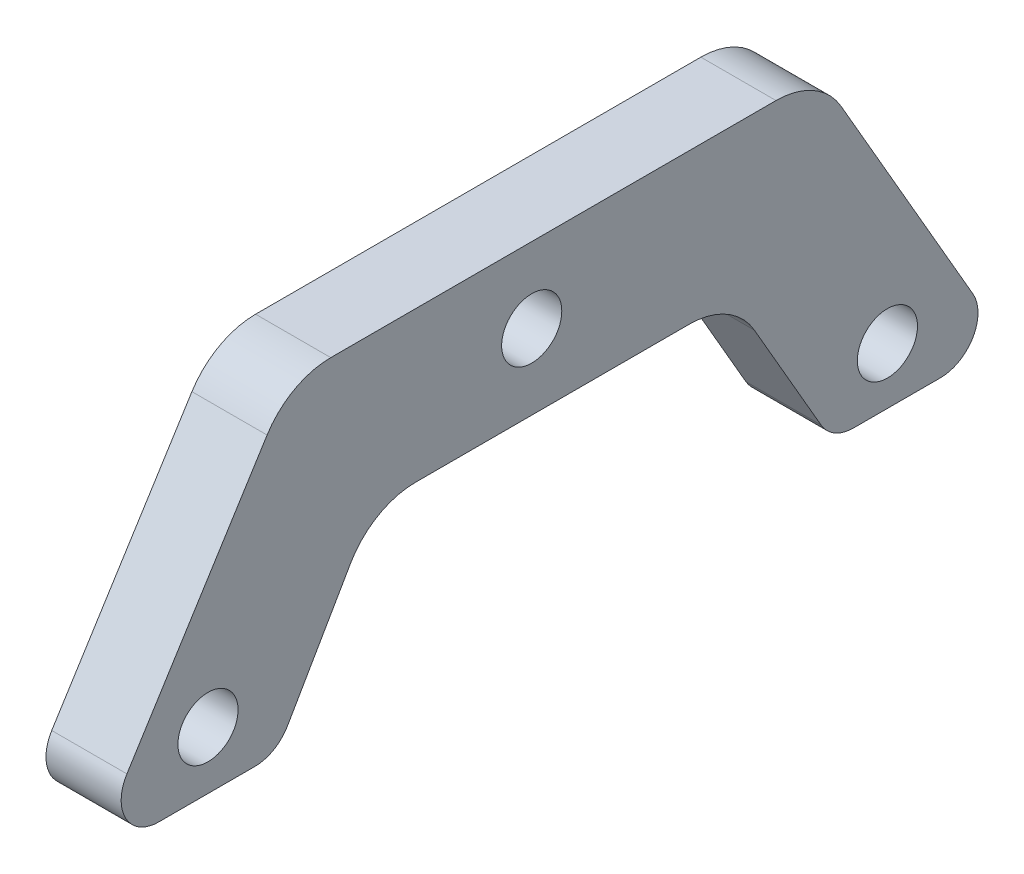
ISO-10303-21;
HEADER;
FILE_DESCRIPTION(('STEP AP214'),'2;1');
FILE_NAME('part.step','',(''),(''),'','','');
FILE_SCHEMA(('AUTOMOTIVE_DESIGN { 1 0 10303 214 1 1 1 1 }'));
ENDSEC;
DATA;
#1=APPLICATION_CONTEXT('core data for automotive mechanical design processes');
#2=APPLICATION_PROTOCOL_DEFINITION('international standard','automotive_design',2000,#1);
#3=PRODUCT_CONTEXT('',#1,'mechanical');
#4=PRODUCT('Part','Part','',(#3));
#5=PRODUCT_RELATED_PRODUCT_CATEGORY('part','',(#4));
#6=PRODUCT_DEFINITION_FORMATION('','',#4);
#7=PRODUCT_DEFINITION_CONTEXT('part definition',#1,'design');
#8=PRODUCT_DEFINITION('design','',#6,#7);
#9=PRODUCT_DEFINITION_SHAPE('','',#8);
#10=(LENGTH_UNIT() NAMED_UNIT(*) SI_UNIT(.MILLI.,.METRE.));
#11=(NAMED_UNIT(*) PLANE_ANGLE_UNIT() SI_UNIT($,.RADIAN.));
#12=(NAMED_UNIT(*) SI_UNIT($,.STERADIAN.) SOLID_ANGLE_UNIT());
#13=UNCERTAINTY_MEASURE_WITH_UNIT(LENGTH_MEASURE(1.E-05),#10,'distance_accuracy_value','');
#14=(GEOMETRIC_REPRESENTATION_CONTEXT(3) GLOBAL_UNCERTAINTY_ASSIGNED_CONTEXT((#13)) GLOBAL_UNIT_ASSIGNED_CONTEXT((#10,
#11,#12)) REPRESENTATION_CONTEXT('',''));
#15=CARTESIAN_POINT('',(0.,0.,0.));
#16=DIRECTION('',(0.,0.,1.));
#17=DIRECTION('',(1.,0.,0.));
#18=AXIS2_PLACEMENT_3D('',#15,#16,#17);
#19=CARTESIAN_POINT('',(20.,79.4132003226979,-33.441717861569));
#20=DIRECTION('',(-1.,0.,0.));
#21=DIRECTION('',(0.,0.,1.));
#22=AXIS2_PLACEMENT_3D('',#19,#20,#21);
#23=PLANE('',#22);
#24=CARTESIAN_POINT('',(20.,79.4132003226979,-33.441717861569));
#25=DIRECTION('',(1.,0.,0.));
#26=DIRECTION('',(0.,0.,1.));
#27=AXIS2_PLACEMENT_3D('',#24,#25,#26);
#28=CIRCLE('',#27,20.);
#29=CARTESIAN_POINT('',(20.,89.4132003226979,-50.7622259372578));
#30=VERTEX_POINT('',#29);
#31=CARTESIAN_POINT('',(20.,99.413200322698,-33.441717861569));
#32=VERTEX_POINT('',#31);
#33=EDGE_CURVE('E213',#30,#32,#28,.T.);
#34=ORIENTED_EDGE('',*,*,#33,.T.);
#35=DIRECTION('',(0.,0.,1.));
#36=VECTOR('',#35,1.);
#37=CARTESIAN_POINT('',(20.,99.4132003226979,85.0148117733055));
#38=LINE('',#37,#36);
#39=CARTESIAN_POINT('',(20.,99.4132003226979,85.0148117733055));
#40=VERTEX_POINT('',#39);
#41=EDGE_CURVE('E121',#32,#40,#38,.T.);
#42=ORIENTED_EDGE('',*,*,#41,.T.);
#43=CARTESIAN_POINT('',(20.,79.4132003226979,85.0148117733055));
#44=DIRECTION('',(1.,0.,0.));
#45=DIRECTION('',(0.,0.,1.));
#46=AXIS2_PLACEMENT_3D('',#43,#44,#45);
#47=CIRCLE('',#46,20.);
#48=CARTESIAN_POINT('',(20.,90.0444133405808,101.955216425155));
#49=VERTEX_POINT('',#48);
#50=EDGE_CURVE('E252',#40,#49,#47,.T.);
#51=ORIENTED_EDGE('',*,*,#50,.T.);
#52=DIRECTION('',(0.,-0.847020232592466,0.531560650894143));
#53=VECTOR('',#52,1.);
#54=CARTESIAN_POINT('',(20.,30.6196977352075,139.248116040682));
#55=LINE('',#54,#53);
#56=CARTESIAN_POINT('',(20.,30.6196977352075,139.248116040682));
#57=VERTEX_POINT('',#56);
#58=EDGE_CURVE('E271',#49,#57,#55,.T.);
#59=ORIENTED_EDGE('',*,*,#58,.T.);
#60=CARTESIAN_POINT('',(20.,25.3040912262661,130.777913714758));
#61=DIRECTION('',(1.,0.,0.));
#62=DIRECTION('',(0.,0.,-1.));
#63=AXIS2_PLACEMENT_3D('',#60,#61,#62);
#64=CIRCLE('',#63,10.);
#65=CARTESIAN_POINT('',(20.,15.3040912262661,130.777913714757));
#66=VERTEX_POINT('',#65);
#67=EDGE_CURVE('E268',#57,#66,#64,.T.);
#68=ORIENTED_EDGE('',*,*,#67,.T.);
#69=DIRECTION('',(0.,0.,-1.));
#70=VECTOR('',#69,1.);
#71=CARTESIAN_POINT('',(20.,15.3040912262661,105.193843035491));
#72=LINE('',#71,#70);
#73=CARTESIAN_POINT('',(20.,15.3040912262661,105.193843035491));
#74=VERTEX_POINT('',#73);
#75=EDGE_CURVE('E270',#66,#74,#72,.T.);
#76=ORIENTED_EDGE('',*,*,#75,.T.);
#77=CARTESIAN_POINT('',(20.,25.3040912262661,105.193843035491));
#78=DIRECTION('',(1.,0.,0.));
#79=DIRECTION('',(0.,0.,1.));
#80=AXIS2_PLACEMENT_3D('',#77,#78,#79);
#81=CIRCLE('',#80,9.99999999999997);
#82=CARTESIAN_POINT('',(20.,20.3040912262661,96.5335889976469));
#83=VERTEX_POINT('',#82);
#84=EDGE_CURVE('E273',#74,#83,#81,.T.);
#85=ORIENTED_EDGE('',*,*,#84,.T.);
#86=DIRECTION('',(0.,0.86602540378444,-0.499999999999998));
#87=VECTOR('',#86,1.);
#88=CARTESIAN_POINT('',(20.,49.4132003226979,79.727437024952));
#89=LINE('',#88,#87);
#90=CARTESIAN_POINT('',(20.,49.4132003226979,79.727437024952));
#91=VERTEX_POINT('',#90);
#92=EDGE_CURVE('E279',#83,#91,#89,.T.);
#93=ORIENTED_EDGE('',*,*,#92,.T.);
#94=CARTESIAN_POINT('',(20.,39.4132003226979,62.4069289492632));
#95=DIRECTION('',(-1.,0.,0.));
#96=DIRECTION('',(0.,0.,-1.));
#97=AXIS2_PLACEMENT_3D('',#94,#95,#96);
#98=CIRCLE('',#97,20.);
#99=CARTESIAN_POINT('',(20.,59.4132003226979,62.4069289492632));
#100=VERTEX_POINT('',#99);
#101=EDGE_CURVE('E281',#91,#100,#98,.T.);
#102=ORIENTED_EDGE('',*,*,#101,.T.);
#103=DIRECTION('',(0.,0.,-1.));
#104=VECTOR('',#103,1.);
#105=CARTESIAN_POINT('',(20.,59.4132003226979,-10.3477070939838));
#106=LINE('',#105,#104);
#107=CARTESIAN_POINT('',(20.,59.4132003226979,-10.3477070939838));
#108=VERTEX_POINT('',#107);
#109=EDGE_CURVE('E283',#100,#108,#106,.T.);
#110=ORIENTED_EDGE('',*,*,#109,.T.);
#111=CARTESIAN_POINT('',(20.,39.4132003226979,-10.3477070939839));
#112=DIRECTION('',(-1.,0.,0.));
#113=DIRECTION('',(0.,0.,-1.));
#114=AXIS2_PLACEMENT_3D('',#111,#112,#113);
#115=CIRCLE('',#114,20.);
#116=CARTESIAN_POINT('',(20.,49.4132003226979,-27.6682151696727));
#117=VERTEX_POINT('',#116);
#118=EDGE_CURVE('E285',#108,#117,#115,.T.);
#119=ORIENTED_EDGE('',*,*,#118,.T.);
#120=DIRECTION('',(0.,-0.86602540378444,-0.499999999999998));
#121=VECTOR('',#120,1.);
#122=CARTESIAN_POINT('',(20.,18.655131805957,-45.426394307566));
#123=LINE('',#122,#121);
#124=CARTESIAN_POINT('',(20.,18.655131805957,-45.426394307566));
#125=VERTEX_POINT('',#124);
#126=EDGE_CURVE('E287',#117,#125,#123,.T.);
#127=ORIENTED_EDGE('',*,*,#126,.T.);
#128=CARTESIAN_POINT('',(20.,23.655131805957,-54.0866483454104));
#129=DIRECTION('',(1.,0.,0.));
#130=DIRECTION('',(0.,0.,1.));
#131=AXIS2_PLACEMENT_3D('',#128,#129,#130);
#132=CIRCLE('',#131,9.99999999999999);
#133=CARTESIAN_POINT('',(20.,13.655131805957,-54.0866483454104));
#134=VERTEX_POINT('',#133);
#135=EDGE_CURVE('E164',#125,#134,#132,.T.);
#136=ORIENTED_EDGE('',*,*,#135,.T.);
#137=DIRECTION('',(0.,0.,-1.));
#138=VECTOR('',#137,1.);
#139=CARTESIAN_POINT('',(20.,13.655131805957,-77.1806591129954));
#140=LINE('',#139,#138);
#141=CARTESIAN_POINT('',(20.,13.655131805957,-77.1806591129954));
#142=VERTEX_POINT('',#141);
#143=EDGE_CURVE('E158',#134,#142,#140,.T.);
#144=ORIENTED_EDGE('',*,*,#143,.T.);
#145=CARTESIAN_POINT('',(20.,23.655131805957,-77.1806591129954));
#146=DIRECTION('',(1.,0.,0.));
#147=DIRECTION('',(0.,0.,1.));
#148=AXIS2_PLACEMENT_3D('',#145,#146,#147);
#149=CIRCLE('',#148,9.99999999999999);
#150=CARTESIAN_POINT('',(20.,28.655131805957,-85.8409131508398));
#151=VERTEX_POINT('',#150);
#152=EDGE_CURVE('E162',#142,#151,#149,.T.);
#153=ORIENTED_EDGE('',*,*,#152,.T.);
#154=DIRECTION('',(0.,0.866025403784439,0.499999999999998));
#155=VECTOR('',#154,1.);
#156=CARTESIAN_POINT('',(20.,89.4132003226979,-50.7622259372578));
#157=LINE('',#156,#155);
#158=EDGE_CURVE('E54',#151,#30,#157,.T.);
#159=ORIENTED_EDGE('',*,*,#158,.T.);
#160=EDGE_LOOP('',(#34,#42,#51,#59,#68,#76,#85,#93,#102,#110,#119,#127,#136,#144,#153,#159));
#161=FACE_BOUND('',#160,.T.);
#162=CARTESIAN_POINT('',(20.,79.4132003226979,31.5538436649325));
#163=DIRECTION('',(1.,0.,0.));
#164=DIRECTION('',(0.,0.,-1.));
#165=AXIS2_PLACEMENT_3D('',#162,#163,#164);
#166=CIRCLE('',#165,8.);
#167=CARTESIAN_POINT('',(20.,79.4132003226979,23.5538436649325));
#168=VERTEX_POINT('',#167);
#169=EDGE_CURVE('E186',#168,#168,#166,.T.);
#170=ORIENTED_EDGE('',*,*,#169,.F.);
#171=EDGE_LOOP('',(#170));
#172=FACE_BOUND('',#171,.T.);
#173=CARTESIAN_POINT('',(20.,30.6196977352076,117.681607112894));
#174=DIRECTION('',(1.,0.,0.));
#175=DIRECTION('',(0.,0.,-1.));
#176=AXIS2_PLACEMENT_3D('',#173,#174,#175);
#177=CIRCLE('',#176,8.00000000000001);
#178=CARTESIAN_POINT('',(20.,30.6196977352076,109.681607112894));
#179=VERTEX_POINT('',#178);
#180=EDGE_CURVE('E341',#179,#179,#177,.T.);
#181=ORIENTED_EDGE('',*,*,#180,.F.);
#182=EDGE_LOOP('',(#181));
#183=FACE_BOUND('',#182,.T.);
#184=CARTESIAN_POINT('',(20.,28.655131805957,-63.0733701232881));
#185=DIRECTION('',(1.,0.,0.));
#186=DIRECTION('',(0.,0.,-1.));
#187=AXIS2_PLACEMENT_3D('',#184,#185,#186);
#188=CIRCLE('',#187,8.00000000000001);
#189=CARTESIAN_POINT('',(20.,28.655131805957,-71.0733701232881));
#190=VERTEX_POINT('',#189);
#191=EDGE_CURVE('E332',#190,#190,#188,.T.);
#192=ORIENTED_EDGE('',*,*,#191,.F.);
#193=EDGE_LOOP('',(#192));
#194=FACE_BOUND('',#193,.T.);
#195=ADVANCED_FACE('F37',(#161,#172,#183,#194),#23,.F.);
#196=CARTESIAN_POINT('',(0.,79.4132003226979,-33.441717861569));
#197=DIRECTION('',(-1.,0.,0.));
#198=DIRECTION('',(0.,0.,1.));
#199=AXIS2_PLACEMENT_3D('',#196,#197,#198);
#200=PLANE('',#199);
#201=CARTESIAN_POINT('',(0.,30.6196977352076,117.681607112894));
#202=DIRECTION('',(1.,0.,0.));
#203=DIRECTION('',(0.,0.,-1.));
#204=AXIS2_PLACEMENT_3D('',#201,#202,#203);
#205=CIRCLE('',#204,8.00000000000001);
#206=CARTESIAN_POINT('',(0.,30.6196977352076,109.681607112894));
#207=VERTEX_POINT('',#206);
#208=EDGE_CURVE('E338',#207,#207,#205,.T.);
#209=ORIENTED_EDGE('',*,*,#208,.T.);
#210=EDGE_LOOP('',(#209));
#211=FACE_BOUND('',#210,.T.);
#212=CARTESIAN_POINT('',(0.,79.4132003226979,-33.441717861569));
#213=DIRECTION('',(1.,0.,0.));
#214=DIRECTION('',(0.,0.,1.));
#215=AXIS2_PLACEMENT_3D('',#212,#213,#214);
#216=CIRCLE('',#215,20.);
#217=CARTESIAN_POINT('',(0.,89.4132003226979,-50.7622259372578));
#218=VERTEX_POINT('',#217);
#219=CARTESIAN_POINT('',(0.,99.413200322698,-33.441717861569));
#220=VERTEX_POINT('',#219);
#221=EDGE_CURVE('E182',#218,#220,#216,.T.);
#222=ORIENTED_EDGE('',*,*,#221,.F.);
#223=DIRECTION('',(0.,0.866025403784439,0.499999999999998));
#224=VECTOR('',#223,1.);
#225=CARTESIAN_POINT('',(0.,89.4132003226979,-50.7622259372578));
#226=LINE('',#225,#224);
#227=CARTESIAN_POINT('',(0.,28.655131805957,-85.8409131508398));
#228=VERTEX_POINT('',#227);
#229=EDGE_CURVE('E113',#228,#218,#226,.T.);
#230=ORIENTED_EDGE('',*,*,#229,.F.);
#231=CARTESIAN_POINT('',(0.,23.655131805957,-77.1806591129954));
#232=DIRECTION('',(1.,0.,0.));
#233=DIRECTION('',(0.,0.,1.));
#234=AXIS2_PLACEMENT_3D('',#231,#232,#233);
#235=CIRCLE('',#234,9.99999999999999);
#236=CARTESIAN_POINT('',(0.,13.655131805957,-77.1806591129954));
#237=VERTEX_POINT('',#236);
#238=EDGE_CURVE('E107',#237,#228,#235,.T.);
#239=ORIENTED_EDGE('',*,*,#238,.F.);
#240=DIRECTION('',(0.,0.,-1.));
#241=VECTOR('',#240,1.);
#242=CARTESIAN_POINT('',(0.,13.655131805957,-77.1806591129954));
#243=LINE('',#242,#241);
#244=CARTESIAN_POINT('',(0.,13.655131805957,-54.0866483454104));
#245=VERTEX_POINT('',#244);
#246=EDGE_CURVE('E172',#245,#237,#243,.T.);
#247=ORIENTED_EDGE('',*,*,#246,.F.);
#248=CARTESIAN_POINT('',(0.,23.655131805957,-54.0866483454104));
#249=DIRECTION('',(1.,0.,0.));
#250=DIRECTION('',(0.,0.,1.));
#251=AXIS2_PLACEMENT_3D('',#248,#249,#250);
#252=CIRCLE('',#251,9.99999999999999);
#253=CARTESIAN_POINT('',(0.,18.655131805957,-45.426394307566));
#254=VERTEX_POINT('',#253);
#255=EDGE_CURVE('E208',#254,#245,#252,.T.);
#256=ORIENTED_EDGE('',*,*,#255,.F.);
#257=DIRECTION('',(0.,-0.86602540378444,-0.499999999999998));
#258=VECTOR('',#257,1.);
#259=CARTESIAN_POINT('',(0.,18.655131805957,-45.426394307566));
#260=LINE('',#259,#258);
#261=CARTESIAN_POINT('',(0.,49.4132003226979,-27.6682151696727));
#262=VERTEX_POINT('',#261);
#263=EDGE_CURVE('E206',#262,#254,#260,.T.);
#264=ORIENTED_EDGE('',*,*,#263,.F.);
#265=CARTESIAN_POINT('',(0.,39.4132003226979,-10.3477070939839));
#266=DIRECTION('',(-1.,0.,0.));
#267=DIRECTION('',(0.,0.,-1.));
#268=AXIS2_PLACEMENT_3D('',#265,#266,#267);
#269=CIRCLE('',#268,20.);
#270=CARTESIAN_POINT('',(0.,59.4132003226979,-10.3477070939838));
#271=VERTEX_POINT('',#270);
#272=EDGE_CURVE('E204',#271,#262,#269,.T.);
#273=ORIENTED_EDGE('',*,*,#272,.F.);
#274=DIRECTION('',(0.,0.,-1.));
#275=VECTOR('',#274,1.);
#276=CARTESIAN_POINT('',(0.,59.4132003226979,-10.3477070939838));
#277=LINE('',#276,#275);
#278=CARTESIAN_POINT('',(0.,59.4132003226979,62.4069289492632));
#279=VERTEX_POINT('',#278);
#280=EDGE_CURVE('E202',#279,#271,#277,.T.);
#281=ORIENTED_EDGE('',*,*,#280,.F.);
#282=CARTESIAN_POINT('',(0.,39.4132003226979,62.4069289492632));
#283=DIRECTION('',(-1.,0.,0.));
#284=DIRECTION('',(0.,0.,-1.));
#285=AXIS2_PLACEMENT_3D('',#282,#283,#284);
#286=CIRCLE('',#285,20.);
#287=CARTESIAN_POINT('',(0.,49.4132003226979,79.727437024952));
#288=VERTEX_POINT('',#287);
#289=EDGE_CURVE('E200',#288,#279,#286,.T.);
#290=ORIENTED_EDGE('',*,*,#289,.F.);
#291=DIRECTION('',(0.,0.86602540378444,-0.499999999999998));
#292=VECTOR('',#291,1.);
#293=CARTESIAN_POINT('',(0.,49.4132003226979,79.727437024952));
#294=LINE('',#293,#292);
#295=CARTESIAN_POINT('',(0.,20.3040912262661,96.5335889976469));
#296=VERTEX_POINT('',#295);
#297=EDGE_CURVE('E198',#296,#288,#294,.T.);
#298=ORIENTED_EDGE('',*,*,#297,.F.);
#299=CARTESIAN_POINT('',(0.,25.3040912262661,105.193843035491));
#300=DIRECTION('',(1.,0.,0.));
#301=DIRECTION('',(0.,0.,1.));
#302=AXIS2_PLACEMENT_3D('',#299,#300,#301);
#303=CIRCLE('',#302,9.99999999999997);
#304=CARTESIAN_POINT('',(0.,15.3040912262661,105.193843035491));
#305=VERTEX_POINT('',#304);
#306=EDGE_CURVE('E196',#305,#296,#303,.T.);
#307=ORIENTED_EDGE('',*,*,#306,.F.);
#308=DIRECTION('',(0.,0.,-1.));
#309=VECTOR('',#308,1.);
#310=CARTESIAN_POINT('',(0.,15.3040912262661,105.193843035491));
#311=LINE('',#310,#309);
#312=CARTESIAN_POINT('',(0.,15.3040912262661,130.777913714757));
#313=VERTEX_POINT('',#312);
#314=EDGE_CURVE('E194',#313,#305,#311,.T.);
#315=ORIENTED_EDGE('',*,*,#314,.F.);
#316=CARTESIAN_POINT('',(0.,25.3040912262661,130.777913714758));
#317=DIRECTION('',(1.,0.,0.));
#318=DIRECTION('',(0.,0.,-1.));
#319=AXIS2_PLACEMENT_3D('',#316,#317,#318);
#320=CIRCLE('',#319,10.);
#321=CARTESIAN_POINT('',(0.,30.6196977352075,139.248116040682));
#322=VERTEX_POINT('',#321);
#323=EDGE_CURVE('E192',#322,#313,#320,.T.);
#324=ORIENTED_EDGE('',*,*,#323,.F.);
#325=DIRECTION('',(0.,-0.847020232592466,0.531560650894143));
#326=VECTOR('',#325,1.);
#327=CARTESIAN_POINT('',(0.,30.6196977352075,139.248116040682));
#328=LINE('',#327,#326);
#329=CARTESIAN_POINT('',(0.,90.0444133405808,101.955216425155));
#330=VERTEX_POINT('',#329);
#331=EDGE_CURVE('E190',#330,#322,#328,.T.);
#332=ORIENTED_EDGE('',*,*,#331,.F.);
#333=CARTESIAN_POINT('',(0.,79.4132003226979,85.0148117733055));
#334=DIRECTION('',(1.,0.,0.));
#335=DIRECTION('',(0.,0.,1.));
#336=AXIS2_PLACEMENT_3D('',#333,#334,#335);
#337=CIRCLE('',#336,20.);
#338=CARTESIAN_POINT('',(0.,99.4132003226979,85.0148117733055));
#339=VERTEX_POINT('',#338);
#340=EDGE_CURVE('E188',#339,#330,#337,.T.);
#341=ORIENTED_EDGE('',*,*,#340,.F.);
#342=DIRECTION('',(0.,0.,1.));
#343=VECTOR('',#342,1.);
#344=CARTESIAN_POINT('',(0.,99.4132003226979,85.0148117733055));
#345=LINE('',#344,#343);
#346=EDGE_CURVE('E185',#220,#339,#345,.T.);
#347=ORIENTED_EDGE('',*,*,#346,.F.);
#348=EDGE_LOOP('',(#222,#230,#239,#247,#256,#264,#273,#281,#290,#298,#307,#315,#324,#332,#341,#347));
#349=FACE_BOUND('',#348,.T.);
#350=CARTESIAN_POINT('',(0.,79.4132003226979,31.5538436649325));
#351=DIRECTION('',(1.,0.,0.));
#352=DIRECTION('',(0.,0.,-1.));
#353=AXIS2_PLACEMENT_3D('',#350,#351,#352);
#354=CIRCLE('',#353,8.);
#355=CARTESIAN_POINT('',(0.,79.4132003226979,23.5538436649325));
#356=VERTEX_POINT('',#355);
#357=EDGE_CURVE('E344',#356,#356,#354,.T.);
#358=ORIENTED_EDGE('',*,*,#357,.T.);
#359=EDGE_LOOP('',(#358));
#360=FACE_BOUND('',#359,.T.);
#361=CARTESIAN_POINT('',(0.,28.655131805957,-63.0733701232881));
#362=DIRECTION('',(1.,0.,0.));
#363=DIRECTION('',(0.,0.,-1.));
#364=AXIS2_PLACEMENT_3D('',#361,#362,#363);
#365=CIRCLE('',#364,8.00000000000001);
#366=CARTESIAN_POINT('',(0.,28.655131805957,-71.0733701232881));
#367=VERTEX_POINT('',#366);
#368=EDGE_CURVE('E335',#367,#367,#365,.T.);
#369=ORIENTED_EDGE('',*,*,#368,.T.);
#370=EDGE_LOOP('',(#369));
#371=FACE_BOUND('',#370,.T.);
#372=ADVANCED_FACE('F256',(#211,#349,#360,#371),#200,.T.);
#373=CARTESIAN_POINT('',(20.,79.4132003226979,-33.441717861569));
#374=DIRECTION('',(-1.,0.,0.));
#375=DIRECTION('',(0.,0.,1.));
#376=AXIS2_PLACEMENT_3D('',#373,#374,#375);
#377=CYLINDRICAL_SURFACE('',#376,20.);
#378=ORIENTED_EDGE('',*,*,#221,.T.);
#379=DIRECTION('',(-1.,0.,0.));
#380=VECTOR('',#379,1.);
#381=CARTESIAN_POINT('',(20.,99.413200322698,-33.441717861569));
#382=LINE('',#381,#380);
#383=EDGE_CURVE('E11',#32,#220,#382,.T.);
#384=ORIENTED_EDGE('',*,*,#383,.F.);
#385=ORIENTED_EDGE('',*,*,#33,.F.);
#386=DIRECTION('',(-1.,0.,0.));
#387=VECTOR('',#386,1.);
#388=CARTESIAN_POINT('',(20.,89.4132003226979,-50.7622259372578));
#389=LINE('',#388,#387);
#390=EDGE_CURVE('E178',#30,#218,#389,.T.);
#391=ORIENTED_EDGE('',*,*,#390,.T.);
#392=EDGE_LOOP('',(#378,#384,#385,#391));
#393=FACE_BOUND('',#392,.T.);
#394=ADVANCED_FACE('F39',(#393),#377,.T.);
#395=CARTESIAN_POINT('',(20.,99.4132003226979,85.0148117733055));
#396=DIRECTION('',(0.,-1.,0.));
#397=DIRECTION('',(0.,0.,-1.));
#398=AXIS2_PLACEMENT_3D('',#395,#396,#397);
#399=PLANE('',#398);
#400=ORIENTED_EDGE('',*,*,#346,.T.);
#401=DIRECTION('',(-1.,0.,0.));
#402=VECTOR('',#401,1.);
#403=CARTESIAN_POINT('',(20.,99.4132003226979,85.0148117733055));
#404=LINE('',#403,#402);
#405=EDGE_CURVE('E46',#40,#339,#404,.T.);
#406=ORIENTED_EDGE('',*,*,#405,.F.);
#407=ORIENTED_EDGE('',*,*,#41,.F.);
#408=ORIENTED_EDGE('',*,*,#383,.T.);
#409=EDGE_LOOP('',(#400,#406,#407,#408));
#410=FACE_BOUND('',#409,.T.);
#411=ADVANCED_FACE('F501',(#410),#399,.F.);
#412=CARTESIAN_POINT('',(20.,79.4132003226979,85.0148117733055));
#413=DIRECTION('',(-1.,0.,0.));
#414=DIRECTION('',(0.,0.,1.));
#415=AXIS2_PLACEMENT_3D('',#412,#413,#414);
#416=CYLINDRICAL_SURFACE('',#415,20.);
#417=ORIENTED_EDGE('',*,*,#340,.T.);
#418=DIRECTION('',(-1.,0.,0.));
#419=VECTOR('',#418,1.);
#420=CARTESIAN_POINT('',(20.,90.0444133405808,101.955216425155));
#421=LINE('',#420,#419);
#422=EDGE_CURVE('E244',#49,#330,#421,.T.);
#423=ORIENTED_EDGE('',*,*,#422,.F.);
#424=ORIENTED_EDGE('',*,*,#50,.F.);
#425=ORIENTED_EDGE('',*,*,#405,.T.);
#426=EDGE_LOOP('',(#417,#423,#424,#425));
#427=FACE_BOUND('',#426,.T.);
#428=ADVANCED_FACE('F250',(#427),#416,.T.);
#429=CARTESIAN_POINT('',(20.,30.6196977352075,139.248116040682));
#430=DIRECTION('',(0.,-0.531560650894143,-0.847020232592466));
#431=DIRECTION('',(0.,0.847020232592466,-0.531560650894143));
#432=AXIS2_PLACEMENT_3D('',#429,#430,#431);
#433=PLANE('',#432);
#434=ORIENTED_EDGE('',*,*,#331,.T.);
#435=DIRECTION('',(-1.,0.,0.));
#436=VECTOR('',#435,1.);
#437=CARTESIAN_POINT('',(20.,30.6196977352075,139.248116040682));
#438=LINE('',#437,#436);
#439=EDGE_CURVE('E241',#57,#322,#438,.T.);
#440=ORIENTED_EDGE('',*,*,#439,.F.);
#441=ORIENTED_EDGE('',*,*,#58,.F.);
#442=ORIENTED_EDGE('',*,*,#422,.T.);
#443=EDGE_LOOP('',(#434,#440,#441,#442));
#444=FACE_BOUND('',#443,.T.);
#445=ADVANCED_FACE('F262',(#444),#433,.F.);
#446=CARTESIAN_POINT('',(20.,25.3040912262661,130.777913714758));
#447=DIRECTION('',(-1.,0.,0.));
#448=DIRECTION('',(0.,0.,1.));
#449=AXIS2_PLACEMENT_3D('',#446,#447,#448);
#450=CYLINDRICAL_SURFACE('',#449,10.);
#451=ORIENTED_EDGE('',*,*,#323,.T.);
#452=DIRECTION('',(-1.,0.,0.));
#453=VECTOR('',#452,1.);
#454=CARTESIAN_POINT('',(20.,15.3040912262661,130.777913714757));
#455=LINE('',#454,#453);
#456=EDGE_CURVE('E238',#66,#313,#455,.T.);
#457=ORIENTED_EDGE('',*,*,#456,.F.);
#458=ORIENTED_EDGE('',*,*,#67,.F.);
#459=ORIENTED_EDGE('',*,*,#439,.T.);
#460=EDGE_LOOP('',(#451,#457,#458,#459));
#461=FACE_BOUND('',#460,.T.);
#462=ADVANCED_FACE('F266',(#461),#450,.T.);
#463=CARTESIAN_POINT('',(20.,15.3040912262661,105.193843035491));
#464=DIRECTION('',(0.,1.,0.));
#465=DIRECTION('',(0.,0.,1.));
#466=AXIS2_PLACEMENT_3D('',#463,#464,#465);
#467=PLANE('',#466);
#468=ORIENTED_EDGE('',*,*,#314,.T.);
#469=DIRECTION('',(-1.,0.,0.));
#470=VECTOR('',#469,1.);
#471=CARTESIAN_POINT('',(20.,15.3040912262661,105.193843035491));
#472=LINE('',#471,#470);
#473=EDGE_CURVE('E235',#74,#305,#472,.T.);
#474=ORIENTED_EDGE('',*,*,#473,.F.);
#475=ORIENTED_EDGE('',*,*,#75,.F.);
#476=ORIENTED_EDGE('',*,*,#456,.T.);
#477=EDGE_LOOP('',(#468,#474,#475,#476));
#478=FACE_BOUND('',#477,.T.);
#479=ADVANCED_FACE('F462',(#478),#467,.F.);
#480=CARTESIAN_POINT('',(20.,25.3040912262661,105.193843035491));
#481=DIRECTION('',(-1.,0.,0.));
#482=DIRECTION('',(0.,0.,1.));
#483=AXIS2_PLACEMENT_3D('',#480,#481,#482);
#484=CYLINDRICAL_SURFACE('',#483,9.99999999999997);
#485=ORIENTED_EDGE('',*,*,#306,.T.);
#486=DIRECTION('',(-1.,0.,0.));
#487=VECTOR('',#486,1.);
#488=CARTESIAN_POINT('',(20.,20.3040912262661,96.5335889976469));
#489=LINE('',#488,#487);
#490=EDGE_CURVE('E232',#83,#296,#489,.T.);
#491=ORIENTED_EDGE('',*,*,#490,.F.);
#492=ORIENTED_EDGE('',*,*,#84,.F.);
#493=ORIENTED_EDGE('',*,*,#473,.T.);
#494=EDGE_LOOP('',(#485,#491,#492,#493));
#495=FACE_BOUND('',#494,.T.);
#496=ADVANCED_FACE('F451',(#495),#484,.T.);
#497=CARTESIAN_POINT('',(20.,49.4132003226979,79.727437024952));
#498=DIRECTION('',(0.,0.499999999999998,0.86602540378444));
#499=DIRECTION('',(0.,-0.86602540378444,0.499999999999998));
#500=AXIS2_PLACEMENT_3D('',#497,#498,#499);
#501=PLANE('',#500);
#502=ORIENTED_EDGE('',*,*,#297,.T.);
#503=DIRECTION('',(-1.,0.,0.));
#504=VECTOR('',#503,1.);
#505=CARTESIAN_POINT('',(20.,49.4132003226979,79.727437024952));
#506=LINE('',#505,#504);
#507=EDGE_CURVE('E229',#91,#288,#506,.T.);
#508=ORIENTED_EDGE('',*,*,#507,.F.);
#509=ORIENTED_EDGE('',*,*,#92,.F.);
#510=ORIENTED_EDGE('',*,*,#490,.T.);
#511=EDGE_LOOP('',(#502,#508,#509,#510));
#512=FACE_BOUND('',#511,.T.);
#513=ADVANCED_FACE('F440',(#512),#501,.F.);
#514=CARTESIAN_POINT('',(20.,39.4132003226979,62.4069289492632));
#515=DIRECTION('',(-1.,0.,0.));
#516=DIRECTION('',(0.,0.,1.));
#517=AXIS2_PLACEMENT_3D('',#514,#515,#516);
#518=CYLINDRICAL_SURFACE('',#517,20.);
#519=ORIENTED_EDGE('',*,*,#289,.T.);
#520=DIRECTION('',(-1.,0.,0.));
#521=VECTOR('',#520,1.);
#522=CARTESIAN_POINT('',(20.,59.4132003226979,62.4069289492632));
#523=LINE('',#522,#521);
#524=EDGE_CURVE('E226',#100,#279,#523,.T.);
#525=ORIENTED_EDGE('',*,*,#524,.F.);
#526=ORIENTED_EDGE('',*,*,#101,.F.);
#527=ORIENTED_EDGE('',*,*,#507,.T.);
#528=EDGE_LOOP('',(#519,#525,#526,#527));
#529=FACE_BOUND('',#528,.T.);
#530=ADVANCED_FACE('F429',(#529),#518,.F.);
#531=CARTESIAN_POINT('',(20.,59.4132003226979,-10.3477070939838));
#532=DIRECTION('',(0.,1.,0.));
#533=DIRECTION('',(0.,0.,1.));
#534=AXIS2_PLACEMENT_3D('',#531,#532,#533);
#535=PLANE('',#534);
#536=ORIENTED_EDGE('',*,*,#280,.T.);
#537=DIRECTION('',(-1.,0.,0.));
#538=VECTOR('',#537,1.);
#539=CARTESIAN_POINT('',(20.,59.4132003226979,-10.3477070939838));
#540=LINE('',#539,#538);
#541=EDGE_CURVE('E223',#108,#271,#540,.T.);
#542=ORIENTED_EDGE('',*,*,#541,.F.);
#543=ORIENTED_EDGE('',*,*,#109,.F.);
#544=ORIENTED_EDGE('',*,*,#524,.T.);
#545=EDGE_LOOP('',(#536,#542,#543,#544));
#546=FACE_BOUND('',#545,.T.);
#547=ADVANCED_FACE('F418',(#546),#535,.F.);
#548=CARTESIAN_POINT('',(20.,39.4132003226979,-10.3477070939839));
#549=DIRECTION('',(-1.,0.,0.));
#550=DIRECTION('',(0.,0.,1.));
#551=AXIS2_PLACEMENT_3D('',#548,#549,#550);
#552=CYLINDRICAL_SURFACE('',#551,20.);
#553=ORIENTED_EDGE('',*,*,#272,.T.);
#554=DIRECTION('',(-1.,0.,0.));
#555=VECTOR('',#554,1.);
#556=CARTESIAN_POINT('',(20.,49.4132003226979,-27.6682151696727));
#557=LINE('',#556,#555);
#558=EDGE_CURVE('E220',#117,#262,#557,.T.);
#559=ORIENTED_EDGE('',*,*,#558,.F.);
#560=ORIENTED_EDGE('',*,*,#118,.F.);
#561=ORIENTED_EDGE('',*,*,#541,.T.);
#562=EDGE_LOOP('',(#553,#559,#560,#561));
#563=FACE_BOUND('',#562,.T.);
#564=ADVANCED_FACE('F408',(#563),#552,.F.);
#565=CARTESIAN_POINT('',(20.,18.655131805957,-45.426394307566));
#566=DIRECTION('',(0.,0.499999999999998,-0.86602540378444));
#567=DIRECTION('',(0.,0.86602540378444,0.499999999999998));
#568=AXIS2_PLACEMENT_3D('',#565,#566,#567);
#569=PLANE('',#568);
#570=ORIENTED_EDGE('',*,*,#263,.T.);
#571=DIRECTION('',(-1.,0.,0.));
#572=VECTOR('',#571,1.);
#573=CARTESIAN_POINT('',(20.,18.655131805957,-45.426394307566));
#574=LINE('',#573,#572);
#575=EDGE_CURVE('E217',#125,#254,#574,.T.);
#576=ORIENTED_EDGE('',*,*,#575,.F.);
#577=ORIENTED_EDGE('',*,*,#126,.F.);
#578=ORIENTED_EDGE('',*,*,#558,.T.);
#579=EDGE_LOOP('',(#570,#576,#577,#578));
#580=FACE_BOUND('',#579,.T.);
#581=ADVANCED_FACE('F293',(#580),#569,.F.);
#582=CARTESIAN_POINT('',(20.,23.655131805957,-54.0866483454104));
#583=DIRECTION('',(-1.,0.,0.));
#584=DIRECTION('',(0.,0.,1.));
#585=AXIS2_PLACEMENT_3D('',#582,#583,#584);
#586=CYLINDRICAL_SURFACE('',#585,9.99999999999999);
#587=ORIENTED_EDGE('',*,*,#255,.T.);
#588=DIRECTION('',(-1.,0.,0.));
#589=VECTOR('',#588,1.);
#590=CARTESIAN_POINT('',(20.,13.655131805957,-54.0866483454104));
#591=LINE('',#590,#589);
#592=EDGE_CURVE('E173',#134,#245,#591,.T.);
#593=ORIENTED_EDGE('',*,*,#592,.F.);
#594=ORIENTED_EDGE('',*,*,#135,.F.);
#595=ORIENTED_EDGE('',*,*,#575,.T.);
#596=EDGE_LOOP('',(#587,#593,#594,#595));
#597=FACE_BOUND('',#596,.T.);
#598=ADVANCED_FACE('F297',(#597),#586,.T.);
#599=CARTESIAN_POINT('',(20.,13.655131805957,-77.1806591129954));
#600=DIRECTION('',(0.,1.,0.));
#601=DIRECTION('',(0.,0.,1.));
#602=AXIS2_PLACEMENT_3D('',#599,#600,#601);
#603=PLANE('',#602);
#604=ORIENTED_EDGE('',*,*,#246,.T.);
#605=DIRECTION('',(-1.,0.,0.));
#606=VECTOR('',#605,1.);
#607=CARTESIAN_POINT('',(20.,13.655131805957,-77.1806591129954));
#608=LINE('',#607,#606);
#609=EDGE_CURVE('E169',#142,#237,#608,.T.);
#610=ORIENTED_EDGE('',*,*,#609,.F.);
#611=ORIENTED_EDGE('',*,*,#143,.F.);
#612=ORIENTED_EDGE('',*,*,#592,.T.);
#613=EDGE_LOOP('',(#604,#610,#611,#612));
#614=FACE_BOUND('',#613,.T.);
#615=ADVANCED_FACE('F170',(#614),#603,.F.);
#616=CARTESIAN_POINT('',(20.,23.655131805957,-77.1806591129954));
#617=DIRECTION('',(-1.,0.,0.));
#618=DIRECTION('',(0.,0.,1.));
#619=AXIS2_PLACEMENT_3D('',#616,#617,#618);
#620=CYLINDRICAL_SURFACE('',#619,9.99999999999999);
#621=ORIENTED_EDGE('',*,*,#238,.T.);
#622=DIRECTION('',(-1.,0.,0.));
#623=VECTOR('',#622,1.);
#624=CARTESIAN_POINT('',(20.,28.655131805957,-85.8409131508398));
#625=LINE('',#624,#623);
#626=EDGE_CURVE('E174',#151,#228,#625,.T.);
#627=ORIENTED_EDGE('',*,*,#626,.F.);
#628=ORIENTED_EDGE('',*,*,#152,.F.);
#629=ORIENTED_EDGE('',*,*,#609,.T.);
#630=EDGE_LOOP('',(#621,#627,#628,#629));
#631=FACE_BOUND('',#630,.T.);
#632=ADVANCED_FACE('F176',(#631),#620,.T.);
#633=CARTESIAN_POINT('',(20.,89.4132003226979,-50.7622259372578));
#634=DIRECTION('',(0.,-0.499999999999998,0.866025403784439));
#635=DIRECTION('',(0.,-0.86602540378444,-0.499999999999998));
#636=AXIS2_PLACEMENT_3D('',#633,#634,#635);
#637=PLANE('',#636);
#638=ORIENTED_EDGE('',*,*,#229,.T.);
#639=ORIENTED_EDGE('',*,*,#390,.F.);
#640=ORIENTED_EDGE('',*,*,#158,.F.);
#641=ORIENTED_EDGE('',*,*,#626,.T.);
#642=EDGE_LOOP('',(#638,#639,#640,#641));
#643=FACE_BOUND('',#642,.T.);
#644=ADVANCED_FACE('F301',(#643),#637,.F.);
#645=CARTESIAN_POINT('',(20.,79.4132003226979,31.5538436649325));
#646=DIRECTION('',(-1.,0.,0.));
#647=DIRECTION('',(0.,0.,1.));
#648=AXIS2_PLACEMENT_3D('',#645,#646,#647);
#649=CYLINDRICAL_SURFACE('',#648,8.);
#650=ORIENTED_EDGE('',*,*,#169,.T.);
#651=EDGE_LOOP('',(#650));
#652=FACE_BOUND('',#651,.T.);
#653=ORIENTED_EDGE('',*,*,#357,.F.);
#654=EDGE_LOOP('',(#653));
#655=FACE_BOUND('',#654,.T.);
#656=ADVANCED_FACE('F303',(#652,#655),#649,.F.);
#657=CARTESIAN_POINT('',(20.,30.6196977352076,117.681607112894));
#658=DIRECTION('',(-1.,0.,0.));
#659=DIRECTION('',(0.,0.,1.));
#660=AXIS2_PLACEMENT_3D('',#657,#658,#659);
#661=CYLINDRICAL_SURFACE('',#660,8.00000000000001);
#662=ORIENTED_EDGE('',*,*,#180,.T.);
#663=EDGE_LOOP('',(#662));
#664=FACE_BOUND('',#663,.T.);
#665=ORIENTED_EDGE('',*,*,#208,.F.);
#666=EDGE_LOOP('',(#665));
#667=FACE_BOUND('',#666,.T.);
#668=ADVANCED_FACE('F309',(#664,#667),#661,.F.);
#669=CARTESIAN_POINT('',(20.,28.655131805957,-63.0733701232881));
#670=DIRECTION('',(-1.,0.,0.));
#671=DIRECTION('',(0.,0.,1.));
#672=AXIS2_PLACEMENT_3D('',#669,#670,#671);
#673=CYLINDRICAL_SURFACE('',#672,8.00000000000001);
#674=ORIENTED_EDGE('',*,*,#191,.T.);
#675=EDGE_LOOP('',(#674));
#676=FACE_BOUND('',#675,.T.);
#677=ORIENTED_EDGE('',*,*,#368,.F.);
#678=EDGE_LOOP('',(#677));
#679=FACE_BOUND('',#678,.T.);
#680=ADVANCED_FACE('F323',(#676,#679),#673,.F.);
#681=CLOSED_SHELL('',(#195,#372,#394,#411,#428,#445,#462,#479,#496,#513,#530,#547,#564,#581,
#598,#615,#632,#644,#656,#668,#680));
#682=MANIFOLD_SOLID_BREP('B2',#681);
#683=ADVANCED_BREP_SHAPE_REPRESENTATION('',(#18,#682),#14);
#684=SHAPE_DEFINITION_REPRESENTATION(#9,#683);
ENDSEC;
END-ISO-10303-21;
